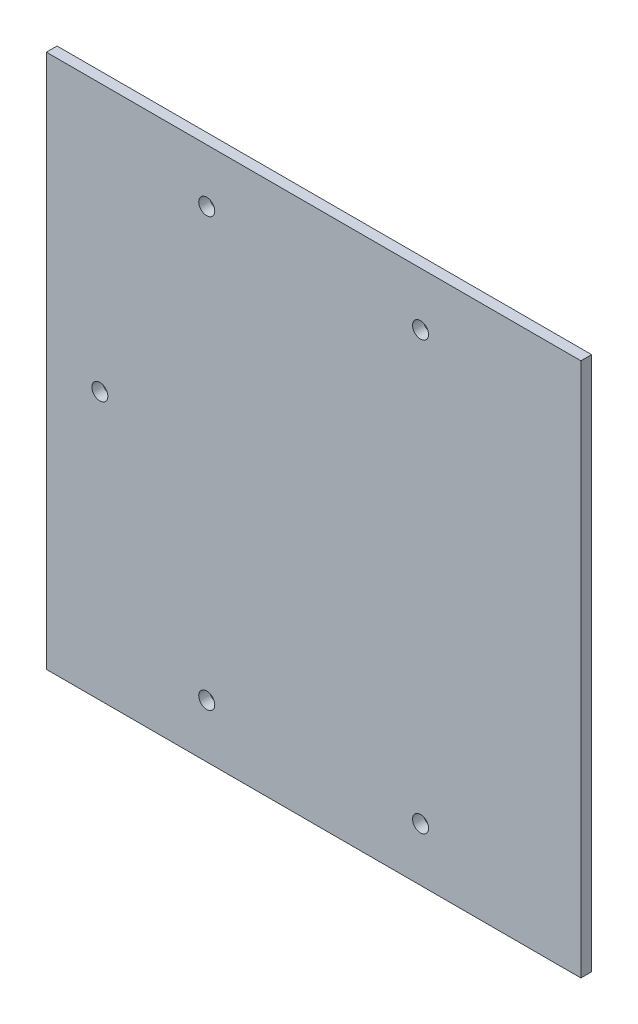
ISO-10303-21;
HEADER;
FILE_DESCRIPTION(('STEP AP214'),'2;1');
FILE_NAME('part.step','',(''),(''),'','','');
FILE_SCHEMA(('AUTOMOTIVE_DESIGN { 1 0 10303 214 1 1 1 1 }'));
ENDSEC;
DATA;
#1=APPLICATION_CONTEXT('core data for automotive mechanical design processes');
#2=APPLICATION_PROTOCOL_DEFINITION('international standard','automotive_design',2000,#1);
#3=PRODUCT_CONTEXT('',#1,'mechanical');
#4=PRODUCT('Part','Part','',(#3));
#5=PRODUCT_RELATED_PRODUCT_CATEGORY('part','',(#4));
#6=PRODUCT_DEFINITION_FORMATION('','',#4);
#7=PRODUCT_DEFINITION_CONTEXT('part definition',#1,'design');
#8=PRODUCT_DEFINITION('design','',#6,#7);
#9=PRODUCT_DEFINITION_SHAPE('','',#8);
#10=(LENGTH_UNIT() NAMED_UNIT(*) SI_UNIT(.MILLI.,.METRE.));
#11=(NAMED_UNIT(*) PLANE_ANGLE_UNIT() SI_UNIT($,.RADIAN.));
#12=(NAMED_UNIT(*) SI_UNIT($,.STERADIAN.) SOLID_ANGLE_UNIT());
#13=UNCERTAINTY_MEASURE_WITH_UNIT(LENGTH_MEASURE(1.E-05),#10,'distance_accuracy_value','');
#14=(GEOMETRIC_REPRESENTATION_CONTEXT(3) GLOBAL_UNCERTAINTY_ASSIGNED_CONTEXT((#13)) GLOBAL_UNIT_ASSIGNED_CONTEXT((#10,
#11,#12)) REPRESENTATION_CONTEXT('',''));
#15=CARTESIAN_POINT('',(0.,0.,0.));
#16=DIRECTION('',(0.,0.,1.));
#17=DIRECTION('',(1.,0.,0.));
#18=AXIS2_PLACEMENT_3D('',#15,#16,#17);
#19=CARTESIAN_POINT('',(50.,50.,2.));
#20=DIRECTION('',(0.,0.,-1.));
#21=DIRECTION('',(-1.,0.,0.));
#22=AXIS2_PLACEMENT_3D('',#19,#20,#21);
#23=PLANE('',#22);
#24=CARTESIAN_POINT('',(-20.,-40.,2.));
#25=DIRECTION('',(0.,0.,-1.));
#26=DIRECTION('',(1.,0.,0.));
#27=AXIS2_PLACEMENT_3D('',#24,#25,#26);
#28=CIRCLE('',#27,1.5);
#29=CARTESIAN_POINT('',(-18.5,-40.,2.));
#30=VERTEX_POINT('',#29);
#31=EDGE_CURVE('E120',#30,#30,#28,.T.);
#32=ORIENTED_EDGE('',*,*,#31,.T.);
#33=EDGE_LOOP('',(#32));
#34=FACE_BOUND('',#33,.T.);
#35=CARTESIAN_POINT('',(-40.,0.,2.));
#36=DIRECTION('',(0.,0.,1.));
#37=DIRECTION('',(1.,0.,0.));
#38=AXIS2_PLACEMENT_3D('',#35,#36,#37);
#39=CIRCLE('',#38,1.5);
#40=CARTESIAN_POINT('',(-38.5,0.,2.));
#41=VERTEX_POINT('',#40);
#42=EDGE_CURVE('E117',#41,#41,#39,.T.);
#43=ORIENTED_EDGE('',*,*,#42,.F.);
#44=EDGE_LOOP('',(#43));
#45=FACE_BOUND('',#44,.T.);
#46=CARTESIAN_POINT('',(20.,40.,2.));
#47=DIRECTION('',(0.,0.,1.));
#48=DIRECTION('',(1.,0.,0.));
#49=AXIS2_PLACEMENT_3D('',#46,#47,#48);
#50=CIRCLE('',#49,1.5);
#51=CARTESIAN_POINT('',(21.5,40.,2.));
#52=VERTEX_POINT('',#51);
#53=EDGE_CURVE('E114',#52,#52,#50,.T.);
#54=ORIENTED_EDGE('',*,*,#53,.F.);
#55=EDGE_LOOP('',(#54));
#56=FACE_BOUND('',#55,.T.);
#57=CARTESIAN_POINT('',(-20.,40.,2.));
#58=DIRECTION('',(0.,0.,1.));
#59=DIRECTION('',(1.,0.,0.));
#60=AXIS2_PLACEMENT_3D('',#57,#58,#59);
#61=CIRCLE('',#60,1.5);
#62=CARTESIAN_POINT('',(-18.5,40.,2.));
#63=VERTEX_POINT('',#62);
#64=EDGE_CURVE('E110',#63,#63,#61,.T.);
#65=ORIENTED_EDGE('',*,*,#64,.F.);
#66=EDGE_LOOP('',(#65));
#67=FACE_BOUND('',#66,.T.);
#68=DIRECTION('',(0.,1.,0.));
#69=VECTOR('',#68,1.);
#70=CARTESIAN_POINT('',(50.,-50.,2.));
#71=LINE('',#70,#69);
#72=CARTESIAN_POINT('',(50.,-50.,2.));
#73=VERTEX_POINT('',#72);
#74=CARTESIAN_POINT('',(50.,50.,2.));
#75=VERTEX_POINT('',#74);
#76=EDGE_CURVE('E86',#73,#75,#71,.T.);
#77=ORIENTED_EDGE('',*,*,#76,.T.);
#78=DIRECTION('',(-1.,0.,0.));
#79=VECTOR('',#78,1.);
#80=CARTESIAN_POINT('',(-50.,50.,2.));
#81=LINE('',#80,#79);
#82=CARTESIAN_POINT('',(-50.,50.,2.));
#83=VERTEX_POINT('',#82);
#84=EDGE_CURVE('E81',#75,#83,#81,.T.);
#85=ORIENTED_EDGE('',*,*,#84,.T.);
#86=DIRECTION('',(0.,-1.,0.));
#87=VECTOR('',#86,1.);
#88=CARTESIAN_POINT('',(-50.,-50.,2.));
#89=LINE('',#88,#87);
#90=CARTESIAN_POINT('',(-50.,-50.,2.));
#91=VERTEX_POINT('',#90);
#92=EDGE_CURVE('E84',#83,#91,#89,.T.);
#93=ORIENTED_EDGE('',*,*,#92,.T.);
#94=DIRECTION('',(1.,0.,0.));
#95=VECTOR('',#94,1.);
#96=CARTESIAN_POINT('',(-50.,-50.,2.));
#97=LINE('',#96,#95);
#98=EDGE_CURVE('E51',#91,#73,#97,.T.);
#99=ORIENTED_EDGE('',*,*,#98,.T.);
#100=EDGE_LOOP('',(#77,#85,#93,#99));
#101=FACE_BOUND('',#100,.T.);
#102=CARTESIAN_POINT('',(20.,-40.,2.));
#103=DIRECTION('',(0.,0.,-1.));
#104=DIRECTION('',(1.,0.,0.));
#105=AXIS2_PLACEMENT_3D('',#102,#103,#104);
#106=CIRCLE('',#105,1.5);
#107=CARTESIAN_POINT('',(21.5,-40.,2.));
#108=VERTEX_POINT('',#107);
#109=EDGE_CURVE('E130',#108,#108,#106,.T.);
#110=ORIENTED_EDGE('',*,*,#109,.T.);
#111=EDGE_LOOP('',(#110));
#112=FACE_BOUND('',#111,.T.);
#113=ADVANCED_FACE('F32',(#34,#45,#56,#67,#101,#112),#23,.F.);
#114=CARTESIAN_POINT('',(50.,50.,0.));
#115=DIRECTION('',(0.,0.,-1.));
#116=DIRECTION('',(-1.,0.,0.));
#117=AXIS2_PLACEMENT_3D('',#114,#115,#116);
#118=PLANE('',#117);
#119=CARTESIAN_POINT('',(-20.,-40.,0.));
#120=DIRECTION('',(0.,0.,-1.));
#121=DIRECTION('',(-1.,0.,0.));
#122=AXIS2_PLACEMENT_3D('',#119,#120,#121);
#123=CIRCLE('',#122,1.5);
#124=CARTESIAN_POINT('',(-21.5,-40.,0.));
#125=VERTEX_POINT('',#124);
#126=EDGE_CURVE('E118',#125,#125,#123,.F.);
#127=ORIENTED_EDGE('',*,*,#126,.T.);
#128=EDGE_LOOP('',(#127));
#129=FACE_BOUND('',#128,.T.);
#130=CARTESIAN_POINT('',(-40.,0.,0.));
#131=DIRECTION('',(0.,0.,-1.));
#132=DIRECTION('',(-1.,0.,0.));
#133=AXIS2_PLACEMENT_3D('',#130,#131,#132);
#134=CIRCLE('',#133,1.5);
#135=CARTESIAN_POINT('',(-41.5,0.,0.));
#136=VERTEX_POINT('',#135);
#137=EDGE_CURVE('E115',#136,#136,#134,.T.);
#138=ORIENTED_EDGE('',*,*,#137,.F.);
#139=EDGE_LOOP('',(#138));
#140=FACE_BOUND('',#139,.T.);
#141=CARTESIAN_POINT('',(20.,40.,0.));
#142=DIRECTION('',(0.,0.,-1.));
#143=DIRECTION('',(-1.,0.,0.));
#144=AXIS2_PLACEMENT_3D('',#141,#142,#143);
#145=CIRCLE('',#144,1.5);
#146=CARTESIAN_POINT('',(18.5,40.,0.));
#147=VERTEX_POINT('',#146);
#148=EDGE_CURVE('E111',#147,#147,#145,.T.);
#149=ORIENTED_EDGE('',*,*,#148,.F.);
#150=EDGE_LOOP('',(#149));
#151=FACE_BOUND('',#150,.T.);
#152=CARTESIAN_POINT('',(-20.,40.,0.));
#153=DIRECTION('',(0.,0.,-1.));
#154=DIRECTION('',(-1.,0.,0.));
#155=AXIS2_PLACEMENT_3D('',#152,#153,#154);
#156=CIRCLE('',#155,1.5);
#157=CARTESIAN_POINT('',(-21.5,40.,0.));
#158=VERTEX_POINT('',#157);
#159=EDGE_CURVE('E102',#158,#158,#156,.T.);
#160=ORIENTED_EDGE('',*,*,#159,.F.);
#161=EDGE_LOOP('',(#160));
#162=FACE_BOUND('',#161,.T.);
#163=DIRECTION('',(0.,1.,0.));
#164=VECTOR('',#163,1.);
#165=CARTESIAN_POINT('',(50.,-50.,0.));
#166=LINE('',#165,#164);
#167=CARTESIAN_POINT('',(50.,-50.,0.));
#168=VERTEX_POINT('',#167);
#169=CARTESIAN_POINT('',(50.,50.,0.));
#170=VERTEX_POINT('',#169);
#171=EDGE_CURVE('E99',#168,#170,#166,.T.);
#172=ORIENTED_EDGE('',*,*,#171,.F.);
#173=DIRECTION('',(1.,0.,0.));
#174=VECTOR('',#173,1.);
#175=CARTESIAN_POINT('',(-50.,-50.,0.));
#176=LINE('',#175,#174);
#177=CARTESIAN_POINT('',(-50.,-50.,0.));
#178=VERTEX_POINT('',#177);
#179=EDGE_CURVE('E74',#178,#168,#176,.T.);
#180=ORIENTED_EDGE('',*,*,#179,.F.);
#181=DIRECTION('',(0.,-1.,0.));
#182=VECTOR('',#181,1.);
#183=CARTESIAN_POINT('',(-50.,-50.,0.));
#184=LINE('',#183,#182);
#185=CARTESIAN_POINT('',(-50.,50.,0.));
#186=VERTEX_POINT('',#185);
#187=EDGE_CURVE('E68',#186,#178,#184,.T.);
#188=ORIENTED_EDGE('',*,*,#187,.F.);
#189=DIRECTION('',(-1.,0.,0.));
#190=VECTOR('',#189,1.);
#191=CARTESIAN_POINT('',(-50.,50.,0.));
#192=LINE('',#191,#190);
#193=EDGE_CURVE('E90',#170,#186,#192,.T.);
#194=ORIENTED_EDGE('',*,*,#193,.F.);
#195=EDGE_LOOP('',(#172,#180,#188,#194));
#196=FACE_BOUND('',#195,.T.);
#197=CARTESIAN_POINT('',(20.,-40.,0.));
#198=DIRECTION('',(0.,0.,-1.));
#199=DIRECTION('',(-1.,0.,0.));
#200=AXIS2_PLACEMENT_3D('',#197,#198,#199);
#201=CIRCLE('',#200,1.5);
#202=CARTESIAN_POINT('',(18.5,-40.,0.));
#203=VERTEX_POINT('',#202);
#204=EDGE_CURVE('E36',#203,#203,#201,.F.);
#205=ORIENTED_EDGE('',*,*,#204,.T.);
#206=EDGE_LOOP('',(#205));
#207=FACE_BOUND('',#206,.T.);
#208=ADVANCED_FACE('F141',(#129,#140,#151,#162,#196,#207),#118,.T.);
#209=CARTESIAN_POINT('',(50.,-50.,2.));
#210=DIRECTION('',(-1.,0.,0.));
#211=DIRECTION('',(0.,0.,1.));
#212=AXIS2_PLACEMENT_3D('',#209,#210,#211);
#213=PLANE('',#212);
#214=ORIENTED_EDGE('',*,*,#171,.T.);
#215=DIRECTION('',(0.,0.,-1.));
#216=VECTOR('',#215,1.);
#217=CARTESIAN_POINT('',(50.,50.,2.));
#218=LINE('',#217,#216);
#219=EDGE_CURVE('E11',#75,#170,#218,.T.);
#220=ORIENTED_EDGE('',*,*,#219,.F.);
#221=ORIENTED_EDGE('',*,*,#76,.F.);
#222=DIRECTION('',(0.,0.,-1.));
#223=VECTOR('',#222,1.);
#224=CARTESIAN_POINT('',(50.,-50.,2.));
#225=LINE('',#224,#223);
#226=EDGE_CURVE('E95',#73,#168,#225,.T.);
#227=ORIENTED_EDGE('',*,*,#226,.T.);
#228=EDGE_LOOP('',(#214,#220,#221,#227));
#229=FACE_BOUND('',#228,.T.);
#230=ADVANCED_FACE('F34',(#229),#213,.F.);
#231=CARTESIAN_POINT('',(-50.,50.,2.));
#232=DIRECTION('',(0.,-1.,0.));
#233=DIRECTION('',(0.,0.,-1.));
#234=AXIS2_PLACEMENT_3D('',#231,#232,#233);
#235=PLANE('',#234);
#236=ORIENTED_EDGE('',*,*,#193,.T.);
#237=DIRECTION('',(0.,0.,-1.));
#238=VECTOR('',#237,1.);
#239=CARTESIAN_POINT('',(-50.,50.,2.));
#240=LINE('',#239,#238);
#241=EDGE_CURVE('E42',#83,#186,#240,.T.);
#242=ORIENTED_EDGE('',*,*,#241,.F.);
#243=ORIENTED_EDGE('',*,*,#84,.F.);
#244=ORIENTED_EDGE('',*,*,#219,.T.);
#245=EDGE_LOOP('',(#236,#242,#243,#244));
#246=FACE_BOUND('',#245,.T.);
#247=ADVANCED_FACE('F89',(#246),#235,.F.);
#248=CARTESIAN_POINT('',(-50.,-50.,2.));
#249=DIRECTION('',(1.,0.,0.));
#250=DIRECTION('',(0.,0.,-1.));
#251=AXIS2_PLACEMENT_3D('',#248,#249,#250);
#252=PLANE('',#251);
#253=ORIENTED_EDGE('',*,*,#187,.T.);
#254=DIRECTION('',(0.,0.,-1.));
#255=VECTOR('',#254,1.);
#256=CARTESIAN_POINT('',(-50.,-50.,2.));
#257=LINE('',#256,#255);
#258=EDGE_CURVE('E91',#91,#178,#257,.T.);
#259=ORIENTED_EDGE('',*,*,#258,.F.);
#260=ORIENTED_EDGE('',*,*,#92,.F.);
#261=ORIENTED_EDGE('',*,*,#241,.T.);
#262=EDGE_LOOP('',(#253,#259,#260,#261));
#263=FACE_BOUND('',#262,.T.);
#264=ADVANCED_FACE('F93',(#263),#252,.F.);
#265=CARTESIAN_POINT('',(-50.,-50.,2.));
#266=DIRECTION('',(0.,1.,0.));
#267=DIRECTION('',(0.,0.,1.));
#268=AXIS2_PLACEMENT_3D('',#265,#266,#267);
#269=PLANE('',#268);
#270=ORIENTED_EDGE('',*,*,#179,.T.);
#271=ORIENTED_EDGE('',*,*,#226,.F.);
#272=ORIENTED_EDGE('',*,*,#98,.F.);
#273=ORIENTED_EDGE('',*,*,#258,.T.);
#274=EDGE_LOOP('',(#270,#271,#272,#273));
#275=FACE_BOUND('',#274,.T.);
#276=ADVANCED_FACE('F151',(#275),#269,.F.);
#277=CARTESIAN_POINT('',(-20.,40.,-8.));
#278=DIRECTION('',(0.,0.,1.));
#279=DIRECTION('',(1.,0.,0.));
#280=AXIS2_PLACEMENT_3D('',#277,#278,#279);
#281=CYLINDRICAL_SURFACE('',#280,1.5);
#282=ORIENTED_EDGE('',*,*,#159,.T.);
#283=EDGE_LOOP('',(#282));
#284=FACE_BOUND('',#283,.T.);
#285=ORIENTED_EDGE('',*,*,#64,.T.);
#286=EDGE_LOOP('',(#285));
#287=FACE_BOUND('',#286,.T.);
#288=ADVANCED_FACE('F138',(#284,#287),#281,.F.);
#289=CARTESIAN_POINT('',(20.,40.,-8.));
#290=DIRECTION('',(0.,0.,1.));
#291=DIRECTION('',(1.,0.,0.));
#292=AXIS2_PLACEMENT_3D('',#289,#290,#291);
#293=CYLINDRICAL_SURFACE('',#292,1.5);
#294=ORIENTED_EDGE('',*,*,#148,.T.);
#295=EDGE_LOOP('',(#294));
#296=FACE_BOUND('',#295,.T.);
#297=ORIENTED_EDGE('',*,*,#53,.T.);
#298=EDGE_LOOP('',(#297));
#299=FACE_BOUND('',#298,.T.);
#300=ADVANCED_FACE('F182',(#296,#299),#293,.F.);
#301=CARTESIAN_POINT('',(-40.,0.,-8.));
#302=DIRECTION('',(0.,0.,1.));
#303=DIRECTION('',(1.,0.,0.));
#304=AXIS2_PLACEMENT_3D('',#301,#302,#303);
#305=CYLINDRICAL_SURFACE('',#304,1.5);
#306=ORIENTED_EDGE('',*,*,#137,.T.);
#307=EDGE_LOOP('',(#306));
#308=FACE_BOUND('',#307,.T.);
#309=ORIENTED_EDGE('',*,*,#42,.T.);
#310=EDGE_LOOP('',(#309));
#311=FACE_BOUND('',#310,.T.);
#312=ADVANCED_FACE('F177',(#308,#311),#305,.F.);
#313=CARTESIAN_POINT('',(-20.,-40.,-8.));
#314=DIRECTION('',(0.,0.,1.));
#315=DIRECTION('',(1.,0.,0.));
#316=AXIS2_PLACEMENT_3D('',#313,#314,#315);
#317=CYLINDRICAL_SURFACE('',#316,1.5);
#318=ORIENTED_EDGE('',*,*,#126,.F.);
#319=EDGE_LOOP('',(#318));
#320=FACE_BOUND('',#319,.T.);
#321=ORIENTED_EDGE('',*,*,#31,.F.);
#322=EDGE_LOOP('',(#321));
#323=FACE_BOUND('',#322,.T.);
#324=ADVANCED_FACE('F170',(#320,#323),#317,.F.);
#325=CARTESIAN_POINT('',(20.,-40.,-8.));
#326=DIRECTION('',(0.,0.,1.));
#327=DIRECTION('',(1.,0.,0.));
#328=AXIS2_PLACEMENT_3D('',#325,#326,#327);
#329=CYLINDRICAL_SURFACE('',#328,1.5);
#330=ORIENTED_EDGE('',*,*,#204,.F.);
#331=EDGE_LOOP('',(#330));
#332=FACE_BOUND('',#331,.T.);
#333=ORIENTED_EDGE('',*,*,#109,.F.);
#334=EDGE_LOOP('',(#333));
#335=FACE_BOUND('',#334,.T.);
#336=ADVANCED_FACE('F167',(#332,#335),#329,.F.);
#337=CLOSED_SHELL('',(#113,#208,#230,#247,#264,#276,#288,#300,#312,#324,#336));
#338=MANIFOLD_SOLID_BREP('B2',#337);
#339=ADVANCED_BREP_SHAPE_REPRESENTATION('',(#18,#338),#14);
#340=SHAPE_DEFINITION_REPRESENTATION(#9,#339);
ENDSEC;
END-ISO-10303-21;
